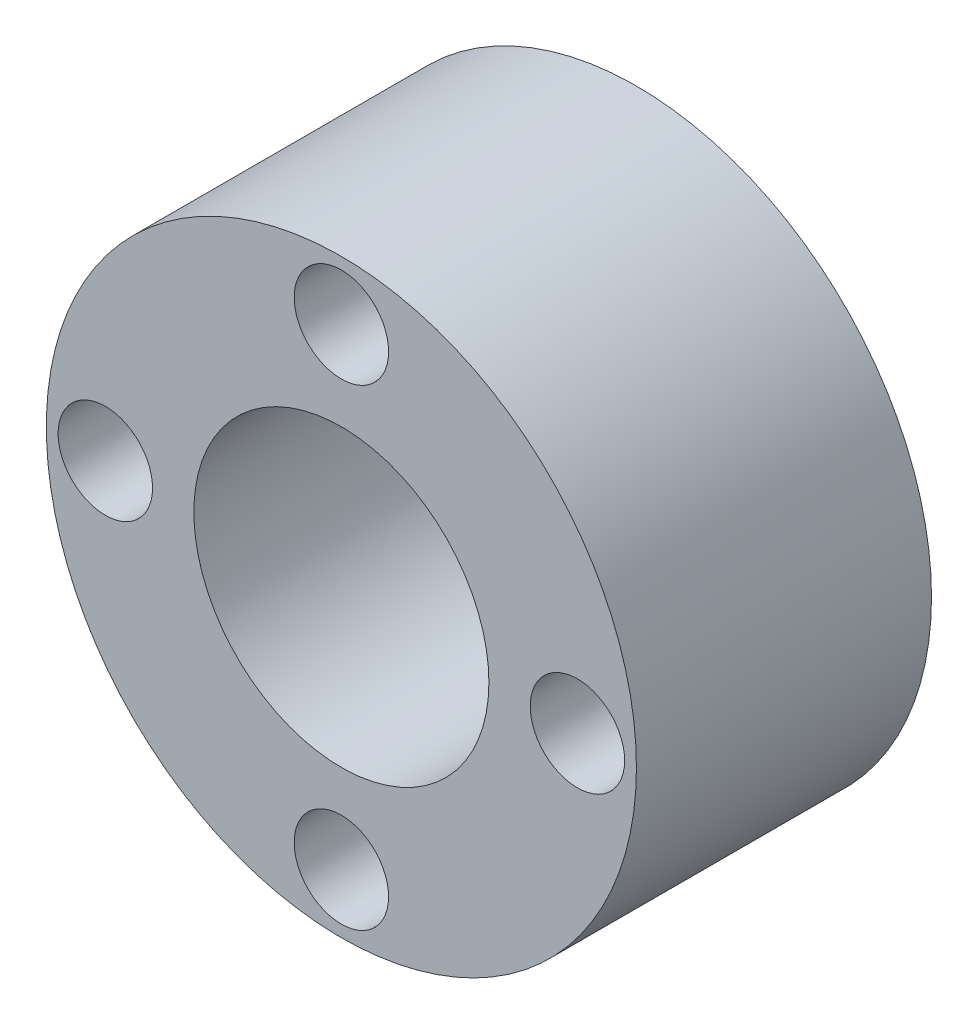
ISO-10303-21;
HEADER;
FILE_DESCRIPTION(('STEP AP214'),'2;1');
FILE_NAME('part.step','',(''),(''),'','','');
FILE_SCHEMA(('AUTOMOTIVE_DESIGN { 1 0 10303 214 1 1 1 1 }'));
ENDSEC;
DATA;
#1=APPLICATION_CONTEXT('core data for automotive mechanical design processes');
#2=APPLICATION_PROTOCOL_DEFINITION('international standard','automotive_design',2000,#1);
#3=PRODUCT_CONTEXT('',#1,'mechanical');
#4=PRODUCT('Part','Part','',(#3));
#5=PRODUCT_RELATED_PRODUCT_CATEGORY('part','',(#4));
#6=PRODUCT_DEFINITION_FORMATION('','',#4);
#7=PRODUCT_DEFINITION_CONTEXT('part definition',#1,'design');
#8=PRODUCT_DEFINITION('design','',#6,#7);
#9=PRODUCT_DEFINITION_SHAPE('','',#8);
#10=(LENGTH_UNIT() NAMED_UNIT(*) SI_UNIT(.MILLI.,.METRE.));
#11=(NAMED_UNIT(*) PLANE_ANGLE_UNIT() SI_UNIT($,.RADIAN.));
#12=(NAMED_UNIT(*) SI_UNIT($,.STERADIAN.) SOLID_ANGLE_UNIT());
#13=UNCERTAINTY_MEASURE_WITH_UNIT(LENGTH_MEASURE(1.E-05),#10,'distance_accuracy_value','');
#14=(GEOMETRIC_REPRESENTATION_CONTEXT(3) GLOBAL_UNCERTAINTY_ASSIGNED_CONTEXT((#13)) GLOBAL_UNIT_ASSIGNED_CONTEXT((#10,
#11,#12)) REPRESENTATION_CONTEXT('',''));
#15=CARTESIAN_POINT('',(0.,0.,0.));
#16=DIRECTION('',(0.,0.,1.));
#17=DIRECTION('',(1.,0.,0.));
#18=AXIS2_PLACEMENT_3D('',#15,#16,#17);
#19=CARTESIAN_POINT('',(0.,0.,5.));
#20=DIRECTION('',(0.,0.,1.));
#21=DIRECTION('',(1.,0.,0.));
#22=AXIS2_PLACEMENT_3D('',#19,#20,#21);
#23=PLANE('',#22);
#24=CARTESIAN_POINT('',(0.,-4.,5.));
#25=DIRECTION('',(0.,0.,1.));
#26=DIRECTION('',(1.,0.,0.));
#27=AXIS2_PLACEMENT_3D('',#24,#25,#26);
#28=CIRCLE('',#27,0.8);
#29=CARTESIAN_POINT('',(0.799999999999972,-4.,5.));
#30=VERTEX_POINT('',#29);
#31=EDGE_CURVE('E67',#30,#30,#28,.T.);
#32=ORIENTED_EDGE('',*,*,#31,.F.);
#33=EDGE_LOOP('',(#32));
#34=FACE_BOUND('',#33,.T.);
#35=CARTESIAN_POINT('',(0.,4.,5.));
#36=DIRECTION('',(0.,0.,1.));
#37=DIRECTION('',(1.,0.,0.));
#38=AXIS2_PLACEMENT_3D('',#35,#36,#37);
#39=CIRCLE('',#38,0.8);
#40=CARTESIAN_POINT('',(0.8,4.,5.));
#41=VERTEX_POINT('',#40);
#42=EDGE_CURVE('E55',#41,#41,#39,.T.);
#43=ORIENTED_EDGE('',*,*,#42,.F.);
#44=EDGE_LOOP('',(#43));
#45=FACE_BOUND('',#44,.T.);
#46=CARTESIAN_POINT('',(0.,0.,5.));
#47=DIRECTION('',(0.,0.,1.));
#48=DIRECTION('',(1.,0.,0.));
#49=AXIS2_PLACEMENT_3D('',#46,#47,#48);
#50=CIRCLE('',#49,5.);
#51=CARTESIAN_POINT('',(5.,0.,5.));
#52=VERTEX_POINT('',#51);
#53=EDGE_CURVE('E10',#52,#52,#50,.T.);
#54=ORIENTED_EDGE('',*,*,#53,.T.);
#55=EDGE_LOOP('',(#54));
#56=FACE_BOUND('',#55,.T.);
#57=CARTESIAN_POINT('',(0.,0.,5.));
#58=DIRECTION('',(0.,0.,1.));
#59=DIRECTION('',(1.,0.,0.));
#60=AXIS2_PLACEMENT_3D('',#57,#58,#59);
#61=CIRCLE('',#60,2.5);
#62=CARTESIAN_POINT('',(2.5,0.,5.));
#63=VERTEX_POINT('',#62);
#64=EDGE_CURVE('E50',#63,#63,#61,.T.);
#65=ORIENTED_EDGE('',*,*,#64,.F.);
#66=EDGE_LOOP('',(#65));
#67=FACE_BOUND('',#66,.T.);
#68=CARTESIAN_POINT('',(4.,0.,5.));
#69=DIRECTION('',(0.,0.,1.));
#70=DIRECTION('',(1.,0.,0.));
#71=AXIS2_PLACEMENT_3D('',#68,#69,#70);
#72=CIRCLE('',#71,0.8);
#73=CARTESIAN_POINT('',(4.8,0.,5.));
#74=VERTEX_POINT('',#73);
#75=EDGE_CURVE('E61',#74,#74,#72,.T.);
#76=ORIENTED_EDGE('',*,*,#75,.F.);
#77=EDGE_LOOP('',(#76));
#78=FACE_BOUND('',#77,.T.);
#79=CARTESIAN_POINT('',(-4.,0.,5.));
#80=DIRECTION('',(0.,0.,1.));
#81=DIRECTION('',(1.,0.,0.));
#82=AXIS2_PLACEMENT_3D('',#79,#80,#81);
#83=CIRCLE('',#82,0.8);
#84=CARTESIAN_POINT('',(-3.2,0.,5.));
#85=VERTEX_POINT('',#84);
#86=EDGE_CURVE('E73',#85,#85,#83,.T.);
#87=ORIENTED_EDGE('',*,*,#86,.F.);
#88=EDGE_LOOP('',(#87));
#89=FACE_BOUND('',#88,.T.);
#90=ADVANCED_FACE('F39',(#34,#45,#56,#67,#78,#89),#23,.T.);
#91=CARTESIAN_POINT('',(0.,0.,0.));
#92=DIRECTION('',(0.,0.,1.));
#93=DIRECTION('',(1.,0.,0.));
#94=AXIS2_PLACEMENT_3D('',#91,#92,#93);
#95=PLANE('',#94);
#96=CARTESIAN_POINT('',(0.,0.,0.));
#97=DIRECTION('',(0.,0.,1.));
#98=DIRECTION('',(1.,0.,0.));
#99=AXIS2_PLACEMENT_3D('',#96,#97,#98);
#100=CIRCLE('',#99,5.);
#101=CARTESIAN_POINT('',(5.,0.,0.));
#102=VERTEX_POINT('',#101);
#103=EDGE_CURVE('E43',#102,#102,#100,.T.);
#104=ORIENTED_EDGE('',*,*,#103,.F.);
#105=EDGE_LOOP('',(#104));
#106=FACE_BOUND('',#105,.T.);
#107=CARTESIAN_POINT('',(0.,0.,0.));
#108=DIRECTION('',(0.,0.,1.));
#109=DIRECTION('',(1.,0.,0.));
#110=AXIS2_PLACEMENT_3D('',#107,#108,#109);
#111=CIRCLE('',#110,2.5);
#112=CARTESIAN_POINT('',(2.5,0.,0.));
#113=VERTEX_POINT('',#112);
#114=EDGE_CURVE('E52',#113,#113,#111,.T.);
#115=ORIENTED_EDGE('',*,*,#114,.T.);
#116=EDGE_LOOP('',(#115));
#117=FACE_BOUND('',#116,.T.);
#118=CARTESIAN_POINT('',(0.,4.,0.));
#119=DIRECTION('',(0.,0.,1.));
#120=DIRECTION('',(1.,0.,0.));
#121=AXIS2_PLACEMENT_3D('',#118,#119,#120);
#122=CIRCLE('',#121,0.8);
#123=CARTESIAN_POINT('',(0.8,4.,0.));
#124=VERTEX_POINT('',#123);
#125=EDGE_CURVE('E58',#124,#124,#122,.T.);
#126=ORIENTED_EDGE('',*,*,#125,.T.);
#127=EDGE_LOOP('',(#126));
#128=FACE_BOUND('',#127,.T.);
#129=CARTESIAN_POINT('',(4.,0.,0.));
#130=DIRECTION('',(0.,0.,1.));
#131=DIRECTION('',(1.,0.,0.));
#132=AXIS2_PLACEMENT_3D('',#129,#130,#131);
#133=CIRCLE('',#132,0.8);
#134=CARTESIAN_POINT('',(4.8,0.,0.));
#135=VERTEX_POINT('',#134);
#136=EDGE_CURVE('E64',#135,#135,#133,.T.);
#137=ORIENTED_EDGE('',*,*,#136,.T.);
#138=EDGE_LOOP('',(#137));
#139=FACE_BOUND('',#138,.T.);
#140=CARTESIAN_POINT('',(0.,-4.,0.));
#141=DIRECTION('',(0.,0.,1.));
#142=DIRECTION('',(1.,0.,0.));
#143=AXIS2_PLACEMENT_3D('',#140,#141,#142);
#144=CIRCLE('',#143,0.8);
#145=CARTESIAN_POINT('',(0.799999999999972,-4.,0.));
#146=VERTEX_POINT('',#145);
#147=EDGE_CURVE('E70',#146,#146,#144,.T.);
#148=ORIENTED_EDGE('',*,*,#147,.T.);
#149=EDGE_LOOP('',(#148));
#150=FACE_BOUND('',#149,.T.);
#151=CARTESIAN_POINT('',(-4.,0.,0.));
#152=DIRECTION('',(0.,0.,1.));
#153=DIRECTION('',(1.,0.,0.));
#154=AXIS2_PLACEMENT_3D('',#151,#152,#153);
#155=CIRCLE('',#154,0.8);
#156=CARTESIAN_POINT('',(-3.2,0.,0.));
#157=VERTEX_POINT('',#156);
#158=EDGE_CURVE('E76',#157,#157,#155,.T.);
#159=ORIENTED_EDGE('',*,*,#158,.T.);
#160=EDGE_LOOP('',(#159));
#161=FACE_BOUND('',#160,.T.);
#162=ADVANCED_FACE('F86',(#106,#117,#128,#139,#150,#161),#95,.F.);
#163=CARTESIAN_POINT('',(0.,0.,5.));
#164=DIRECTION('',(0.,0.,-1.));
#165=DIRECTION('',(-1.,0.,0.));
#166=AXIS2_PLACEMENT_3D('',#163,#164,#165);
#167=CYLINDRICAL_SURFACE('',#166,5.);
#168=ORIENTED_EDGE('',*,*,#53,.F.);
#169=EDGE_LOOP('',(#168));
#170=FACE_BOUND('',#169,.T.);
#171=ORIENTED_EDGE('',*,*,#103,.T.);
#172=EDGE_LOOP('',(#171));
#173=FACE_BOUND('',#172,.T.);
#174=ADVANCED_FACE('F41',(#170,#173),#167,.T.);
#175=CARTESIAN_POINT('',(0.,0.,5.));
#176=DIRECTION('',(0.,0.,-1.));
#177=DIRECTION('',(-1.,0.,0.));
#178=AXIS2_PLACEMENT_3D('',#175,#176,#177);
#179=CYLINDRICAL_SURFACE('',#178,2.5);
#180=ORIENTED_EDGE('',*,*,#64,.T.);
#181=EDGE_LOOP('',(#180));
#182=FACE_BOUND('',#181,.T.);
#183=ORIENTED_EDGE('',*,*,#114,.F.);
#184=EDGE_LOOP('',(#183));
#185=FACE_BOUND('',#184,.T.);
#186=ADVANCED_FACE('F96',(#182,#185),#179,.F.);
#187=CARTESIAN_POINT('',(0.,4.,5.));
#188=DIRECTION('',(0.,0.,-1.));
#189=DIRECTION('',(-1.,0.,0.));
#190=AXIS2_PLACEMENT_3D('',#187,#188,#189);
#191=CYLINDRICAL_SURFACE('',#190,0.8);
#192=ORIENTED_EDGE('',*,*,#42,.T.);
#193=EDGE_LOOP('',(#192));
#194=FACE_BOUND('',#193,.T.);
#195=ORIENTED_EDGE('',*,*,#125,.F.);
#196=EDGE_LOOP('',(#195));
#197=FACE_BOUND('',#196,.T.);
#198=ADVANCED_FACE('F99',(#194,#197),#191,.F.);
#199=CARTESIAN_POINT('',(4.,0.,5.));
#200=DIRECTION('',(0.,0.,-1.));
#201=DIRECTION('',(-1.,0.,0.));
#202=AXIS2_PLACEMENT_3D('',#199,#200,#201);
#203=CYLINDRICAL_SURFACE('',#202,0.8);
#204=ORIENTED_EDGE('',*,*,#75,.T.);
#205=EDGE_LOOP('',(#204));
#206=FACE_BOUND('',#205,.T.);
#207=ORIENTED_EDGE('',*,*,#136,.F.);
#208=EDGE_LOOP('',(#207));
#209=FACE_BOUND('',#208,.T.);
#210=ADVANCED_FACE('F103',(#206,#209),#203,.F.);
#211=CARTESIAN_POINT('',(0.,-4.,5.));
#212=DIRECTION('',(0.,0.,-1.));
#213=DIRECTION('',(-1.,0.,0.));
#214=AXIS2_PLACEMENT_3D('',#211,#212,#213);
#215=CYLINDRICAL_SURFACE('',#214,0.8);
#216=ORIENTED_EDGE('',*,*,#31,.T.);
#217=EDGE_LOOP('',(#216));
#218=FACE_BOUND('',#217,.T.);
#219=ORIENTED_EDGE('',*,*,#147,.F.);
#220=EDGE_LOOP('',(#219));
#221=FACE_BOUND('',#220,.T.);
#222=ADVANCED_FACE('F107',(#218,#221),#215,.F.);
#223=CARTESIAN_POINT('',(-4.,0.,5.));
#224=DIRECTION('',(0.,0.,-1.));
#225=DIRECTION('',(-1.,0.,0.));
#226=AXIS2_PLACEMENT_3D('',#223,#224,#225);
#227=CYLINDRICAL_SURFACE('',#226,0.8);
#228=ORIENTED_EDGE('',*,*,#86,.T.);
#229=EDGE_LOOP('',(#228));
#230=FACE_BOUND('',#229,.T.);
#231=ORIENTED_EDGE('',*,*,#158,.F.);
#232=EDGE_LOOP('',(#231));
#233=FACE_BOUND('',#232,.T.);
#234=ADVANCED_FACE('F82',(#230,#233),#227,.F.);
#235=CLOSED_SHELL('',(#90,#162,#174,#186,#198,#210,#222,#234));
#236=MANIFOLD_SOLID_BREP('B2',#235);
#237=ADVANCED_BREP_SHAPE_REPRESENTATION('',(#18,#236),#14);
#238=SHAPE_DEFINITION_REPRESENTATION(#9,#237);
ENDSEC;
END-ISO-10303-21;
